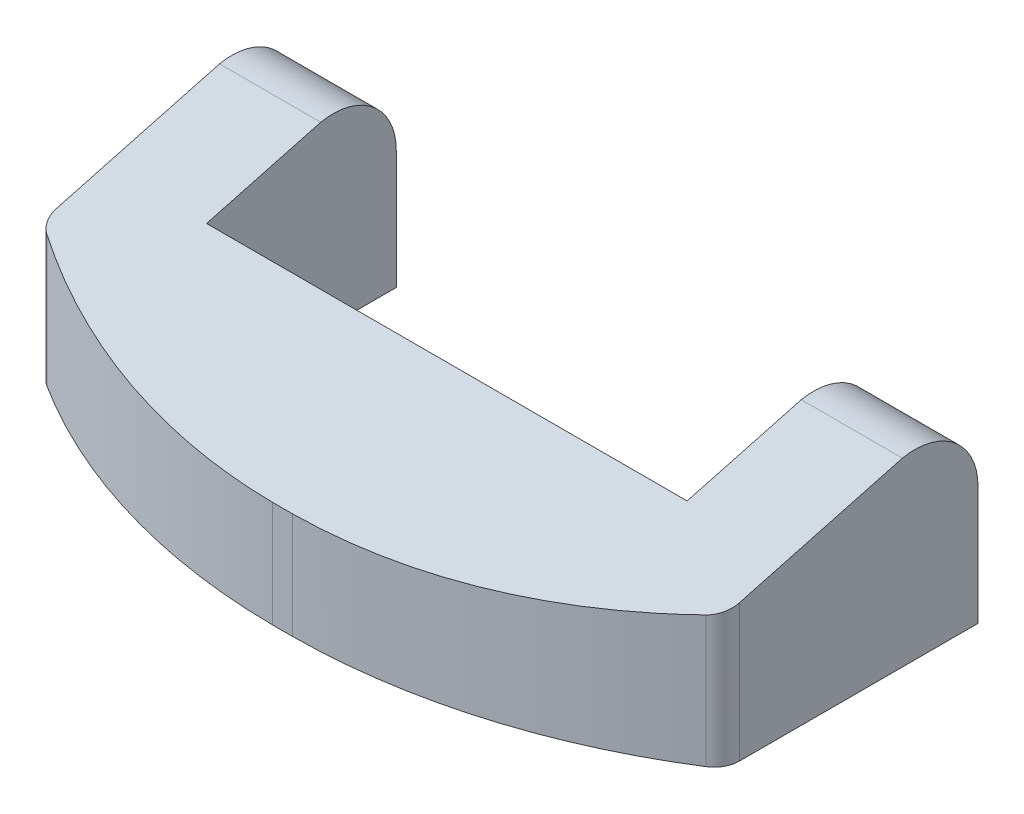
ISO-10303-21;
HEADER;
FILE_DESCRIPTION(('STEP AP214'),'2;1');
FILE_NAME('part.step','',(''),(''),'','','');
FILE_SCHEMA(('AUTOMOTIVE_DESIGN { 1 0 10303 214 1 1 1 1 }'));
ENDSEC;
DATA;
#1=APPLICATION_CONTEXT('core data for automotive mechanical design processes');
#2=APPLICATION_PROTOCOL_DEFINITION('international standard','automotive_design',2000,#1);
#3=PRODUCT_CONTEXT('',#1,'mechanical');
#4=PRODUCT('Part','Part','',(#3));
#5=PRODUCT_RELATED_PRODUCT_CATEGORY('part','',(#4));
#6=PRODUCT_DEFINITION_FORMATION('','',#4);
#7=PRODUCT_DEFINITION_CONTEXT('part definition',#1,'design');
#8=PRODUCT_DEFINITION('design','',#6,#7);
#9=PRODUCT_DEFINITION_SHAPE('','',#8);
#10=(LENGTH_UNIT() NAMED_UNIT(*) SI_UNIT(.MILLI.,.METRE.));
#11=(NAMED_UNIT(*) PLANE_ANGLE_UNIT() SI_UNIT($,.RADIAN.));
#12=(NAMED_UNIT(*) SI_UNIT($,.STERADIAN.) SOLID_ANGLE_UNIT());
#13=UNCERTAINTY_MEASURE_WITH_UNIT(LENGTH_MEASURE(1.E-05),#10,'distance_accuracy_value','');
#14=(GEOMETRIC_REPRESENTATION_CONTEXT(3) GLOBAL_UNCERTAINTY_ASSIGNED_CONTEXT((#13)) GLOBAL_UNIT_ASSIGNED_CONTEXT((#10,
#11,#12)) REPRESENTATION_CONTEXT('',''));
#15=CARTESIAN_POINT('',(0.,0.,0.));
#16=DIRECTION('',(0.,0.,1.));
#17=DIRECTION('',(1.,0.,0.));
#18=AXIS2_PLACEMENT_3D('',#15,#16,#17);
#19=CARTESIAN_POINT('',(813.18049605784,40.,85.));
#20=DIRECTION('',(0.,0.965897786096296,0.258923669860972));
#21=DIRECTION('',(0.,-0.258923669860972,0.965897786096296));
#22=AXIS2_PLACEMENT_3D('',#19,#20,#21);
#23=PLANE('',#22);
#24=CARTESIAN_POINT('',(1.97688044059947,104.33348696392,-154.991858077985));
#25=DIRECTION('',(0.,0.965897786096296,0.258923669860972));
#26=DIRECTION('',(0.,0.258923669860972,-0.965897786096296));
#27=AXIS2_PLACEMENT_3D('',#24,#25,#26);
#28=ELLIPSE('',#27,248.473496320938,240.);
#29=CARTESIAN_POINT('',(3.95376088120073,40.,85.));
#30=VERTEX_POINT('',#29);
#31=CARTESIAN_POINT('',(130.348831285191,49.9746034961205,47.7903951799216));
#32=VERTEX_POINT('',#31);
#33=EDGE_CURVE('E239',#30,#32,#28,.T.);
#34=ORIENTED_EDGE('',*,*,#33,.T.);
#35=CARTESIAN_POINT('',(125.,52.2395569739456,39.3411346275088));
#36=DIRECTION('',(0.,0.965897786096296,0.258923669860972));
#37=DIRECTION('',(0.,0.258923669860972,-0.965897786096296));
#38=AXIS2_PLACEMENT_3D('',#35,#36,#37);
#39=ELLIPSE('',#38,10.3530623467058,10.);
#40=CARTESIAN_POINT('',(135.,52.2395569739456,39.3411346275088));
#41=VERTEX_POINT('',#40);
#42=EDGE_CURVE('E230',#32,#41,#39,.T.);
#43=ORIENTED_EDGE('',*,*,#42,.T.);
#44=DIRECTION('',(0.,-0.258923669860972,0.965897786096296));
#45=VECTOR('',#44,1.);
#46=CARTESIAN_POINT('',(135.,72.1973903219302,-35.1102550675628));
#47=LINE('',#46,#45);
#48=CARTESIAN_POINT('',(135.,69.5183262802999,-25.1161821888245));
#49=VERTEX_POINT('',#48);
#50=EDGE_CURVE('E161',#49,#41,#47,.T.);
#51=ORIENTED_EDGE('',*,*,#50,.F.);
#52=DIRECTION('',(-1.,0.,0.));
#53=VECTOR('',#52,1.);
#54=CARTESIAN_POINT('',(813.18049605784,69.5183262802999,-25.1161821888245));
#55=LINE('',#54,#53);
#56=CARTESIAN_POINT('',(95.,69.5183262802999,-25.1161821888245));
#57=VERTEX_POINT('',#56);
#58=EDGE_CURVE('E243',#49,#57,#55,.T.);
#59=ORIENTED_EDGE('',*,*,#58,.T.);
#60=DIRECTION('',(0.,-0.258923669860972,0.965897786096296));
#61=VECTOR('',#60,1.);
#62=CARTESIAN_POINT('',(95.,54.8336504170334,29.6640389994772));
#63=LINE('',#62,#61);
#64=CARTESIAN_POINT('',(95.,57.4242438312052,20.));
#65=VERTEX_POINT('',#64);
#66=EDGE_CURVE('E251',#57,#65,#63,.T.);
#67=ORIENTED_EDGE('',*,*,#66,.T.);
#68=DIRECTION('',(-1.,0.,0.));
#69=VECTOR('',#68,1.);
#70=CARTESIAN_POINT('',(95.,57.4242438312052,20.));
#71=LINE('',#70,#69);
#72=CARTESIAN_POINT('',(-95.,57.4242438312052,20.));
#73=VERTEX_POINT('',#72);
#74=EDGE_CURVE('E248',#65,#73,#71,.T.);
#75=ORIENTED_EDGE('',*,*,#74,.T.);
#76=DIRECTION('',(0.,0.258923669860972,-0.965897786096296));
#77=VECTOR('',#76,1.);
#78=CARTESIAN_POINT('',(-95.,54.8336504170334,29.6640389994772));
#79=LINE('',#78,#77);
#80=CARTESIAN_POINT('',(-95.,69.5183262802999,-25.1161821888245));
#81=VERTEX_POINT('',#80);
#82=EDGE_CURVE('E167',#73,#81,#79,.T.);
#83=ORIENTED_EDGE('',*,*,#82,.T.);
#84=CARTESIAN_POINT('',(-135.,69.5183262802999,-25.1161821888245));
#85=VERTEX_POINT('',#84);
#86=EDGE_CURVE('E159',#81,#85,#55,.T.);
#87=ORIENTED_EDGE('',*,*,#86,.T.);
#88=DIRECTION('',(0.,0.258923669860972,-0.965897786096296));
#89=VECTOR('',#88,1.);
#90=CARTESIAN_POINT('',(-135.,72.1973903219302,-35.1102550675628));
#91=LINE('',#90,#89);
#92=CARTESIAN_POINT('',(-135.,52.2395569739456,39.3411346275088));
#93=VERTEX_POINT('',#92);
#94=EDGE_CURVE('E149',#93,#85,#91,.T.);
#95=ORIENTED_EDGE('',*,*,#94,.F.);
#96=CARTESIAN_POINT('',(-125.,52.2395569739456,39.3411346275088));
#97=DIRECTION('',(0.,0.965897786096296,0.258923669860972));
#98=DIRECTION('',(0.,0.258923669860972,-0.965897786096296));
#99=AXIS2_PLACEMENT_3D('',#96,#97,#98);
#100=ELLIPSE('',#99,10.3530623467058,10.);
#101=CARTESIAN_POINT('',(-130.348831285191,49.9746034961206,47.7903951799216));
#102=VERTEX_POINT('',#101);
#103=EDGE_CURVE('E137',#93,#102,#100,.T.);
#104=ORIENTED_EDGE('',*,*,#103,.T.);
#105=CARTESIAN_POINT('',(-1.97688044059947,104.33348696392,-154.991858077985));
#106=DIRECTION('',(0.,0.965897786096296,0.258923669860972));
#107=DIRECTION('',(0.,0.258923669860972,-0.965897786096296));
#108=AXIS2_PLACEMENT_3D('',#105,#106,#107);
#109=ELLIPSE('',#108,248.473496320938,240.);
#110=CARTESIAN_POINT('',(-3.95376088120073,40.,85.));
#111=VERTEX_POINT('',#110);
#112=EDGE_CURVE('E236',#102,#111,#109,.T.);
#113=ORIENTED_EDGE('',*,*,#112,.T.);
#114=DIRECTION('',(1.,0.,0.));
#115=VECTOR('',#114,1.);
#116=CARTESIAN_POINT('',(0.,40.,85.));
#117=LINE('',#116,#115);
#118=EDGE_CURVE('E204',#111,#30,#117,.T.);
#119=ORIENTED_EDGE('',*,*,#118,.T.);
#120=EDGE_LOOP('',(#34,#43,#51,#59,#67,#75,#83,#87,#95,#104,#113,#119));
#121=FACE_BOUND('',#120,.T.);
#122=ADVANCED_FACE('F35',(#121),#23,.T.);
#123=CARTESIAN_POINT('',(-135.,-2.,-55.));
#124=DIRECTION('',(-1.,0.,0.));
#125=DIRECTION('',(0.,0.,1.));
#126=AXIS2_PLACEMENT_3D('',#123,#124,#125);
#127=PLANE('',#126);
#128=DIRECTION('',(0.,0.,1.));
#129=VECTOR('',#128,1.);
#130=CARTESIAN_POINT('',(-135.,-2.,-55.));
#131=LINE('',#130,#129);
#132=CARTESIAN_POINT('',(-135.,-2.,-55.));
#133=VERTEX_POINT('',#132);
#134=CARTESIAN_POINT('',(-135.,-2.,39.3411346275088));
#135=VERTEX_POINT('',#134);
#136=EDGE_CURVE('E153',#133,#135,#131,.T.);
#137=ORIENTED_EDGE('',*,*,#136,.T.);
#138=DIRECTION('',(0.,1.,0.));
#139=VECTOR('',#138,1.);
#140=CARTESIAN_POINT('',(-135.,-451.43049605784,39.3411346275088));
#141=LINE('',#140,#139);
#142=EDGE_CURVE('E50',#135,#93,#141,.T.);
#143=ORIENTED_EDGE('',*,*,#142,.T.);
#144=ORIENTED_EDGE('',*,*,#94,.T.);
#145=CARTESIAN_POINT('',(-135.,45.,-30.));
#146=DIRECTION('',(-1.,0.,0.));
#147=DIRECTION('',(0.,0.,1.));
#148=AXIS2_PLACEMENT_3D('',#145,#146,#147);
#149=CIRCLE('',#148,25.);
#150=CARTESIAN_POINT('',(-135.,45.,-55.));
#151=VERTEX_POINT('',#150);
#152=EDGE_CURVE('E164',#85,#151,#149,.T.);
#153=ORIENTED_EDGE('',*,*,#152,.T.);
#154=DIRECTION('',(0.,1.,0.));
#155=VECTOR('',#154,1.);
#156=CARTESIAN_POINT('',(-135.,-2.,-55.));
#157=LINE('',#156,#155);
#158=EDGE_CURVE('E201',#133,#151,#157,.T.);
#159=ORIENTED_EDGE('',*,*,#158,.F.);
#160=EDGE_LOOP('',(#137,#143,#144,#153,#159));
#161=FACE_BOUND('',#160,.T.);
#162=ADVANCED_FACE('F37',(#161),#127,.T.);
#163=CARTESIAN_POINT('',(0.,0.,85.));
#164=DIRECTION('',(0.,0.,-1.));
#165=DIRECTION('',(-1.,0.,0.));
#166=AXIS2_PLACEMENT_3D('',#163,#164,#165);
#167=PLANE('',#166);
#168=DIRECTION('',(0.,1.,0.));
#169=VECTOR('',#168,1.);
#170=CARTESIAN_POINT('',(-3.95376088120073,-451.43049605784,85.));
#171=LINE('',#170,#169);
#172=CARTESIAN_POINT('',(-3.95376088120073,-2.,85.));
#173=VERTEX_POINT('',#172);
#174=EDGE_CURVE('E144',#173,#111,#171,.T.);
#175=ORIENTED_EDGE('',*,*,#174,.F.);
#176=DIRECTION('',(1.,0.,0.));
#177=VECTOR('',#176,1.);
#178=CARTESIAN_POINT('',(-135.,-2.,85.));
#179=LINE('',#178,#177);
#180=CARTESIAN_POINT('',(3.95376088120073,-2.,85.));
#181=VERTEX_POINT('',#180);
#182=EDGE_CURVE('E58',#173,#181,#179,.T.);
#183=ORIENTED_EDGE('',*,*,#182,.T.);
#184=DIRECTION('',(0.,1.,0.));
#185=VECTOR('',#184,1.);
#186=CARTESIAN_POINT('',(3.95376088120073,-451.43049605784,85.));
#187=LINE('',#186,#185);
#188=EDGE_CURVE('E225',#30,#181,#187,.F.);
#189=ORIENTED_EDGE('',*,*,#188,.F.);
#190=ORIENTED_EDGE('',*,*,#118,.F.);
#191=EDGE_LOOP('',(#175,#183,#189,#190));
#192=FACE_BOUND('',#191,.T.);
#193=ADVANCED_FACE('F266',(#192),#167,.F.);
#194=CARTESIAN_POINT('',(0.,-2.,0.));
#195=DIRECTION('',(0.,-1.,0.));
#196=DIRECTION('',(0.,0.,-1.));
#197=AXIS2_PLACEMENT_3D('',#194,#195,#196);
#198=PLANE('',#197);
#199=DIRECTION('',(0.,0.,-1.));
#200=VECTOR('',#199,1.);
#201=CARTESIAN_POINT('',(135.,-2.,-55.));
#202=LINE('',#201,#200);
#203=CARTESIAN_POINT('',(135.,-2.,39.3411346275088));
#204=VERTEX_POINT('',#203);
#205=CARTESIAN_POINT('',(135.,-2.,-55.));
#206=VERTEX_POINT('',#205);
#207=EDGE_CURVE('E194',#204,#206,#202,.T.);
#208=ORIENTED_EDGE('',*,*,#207,.F.);
#209=CARTESIAN_POINT('',(125.,-2.,39.3411346275088));
#210=DIRECTION('',(0.,-1.,0.));
#211=DIRECTION('',(0.,0.,-1.));
#212=AXIS2_PLACEMENT_3D('',#209,#210,#211);
#213=CIRCLE('',#212,10.);
#214=CARTESIAN_POINT('',(130.348831285191,-2.,47.7903951799216));
#215=VERTEX_POINT('',#214);
#216=EDGE_CURVE('E11',#204,#215,#213,.T.);
#217=ORIENTED_EDGE('',*,*,#216,.T.);
#218=CARTESIAN_POINT('',(1.97688044059947,-2.,-154.991858077985));
#219=DIRECTION('',(0.,-1.,0.));
#220=DIRECTION('',(0.,0.,-1.));
#221=AXIS2_PLACEMENT_3D('',#218,#219,#220);
#222=CIRCLE('',#221,240.);
#223=EDGE_CURVE('E43',#215,#181,#222,.T.);
#224=ORIENTED_EDGE('',*,*,#223,.T.);
#225=ORIENTED_EDGE('',*,*,#182,.F.);
#226=CARTESIAN_POINT('',(-1.97688044059947,-2.,-154.991858077985));
#227=DIRECTION('',(0.,-1.,0.));
#228=DIRECTION('',(0.,0.,-1.));
#229=AXIS2_PLACEMENT_3D('',#226,#227,#228);
#230=CIRCLE('',#229,240.);
#231=CARTESIAN_POINT('',(-130.348831285191,-2.,47.7903951799216));
#232=VERTEX_POINT('',#231);
#233=EDGE_CURVE('E213',#173,#232,#230,.T.);
#234=ORIENTED_EDGE('',*,*,#233,.T.);
#235=CARTESIAN_POINT('',(-125.,-2.,39.3411346275088));
#236=DIRECTION('',(0.,-1.,0.));
#237=DIRECTION('',(0.,0.,-1.));
#238=AXIS2_PLACEMENT_3D('',#235,#236,#237);
#239=CIRCLE('',#238,10.);
#240=EDGE_CURVE('E211',#232,#135,#239,.T.);
#241=ORIENTED_EDGE('',*,*,#240,.T.);
#242=ORIENTED_EDGE('',*,*,#136,.F.);
#243=DIRECTION('',(-1.,0.,0.));
#244=VECTOR('',#243,1.);
#245=CARTESIAN_POINT('',(135.,-2.,-55.));
#246=LINE('',#245,#244);
#247=CARTESIAN_POINT('',(-95.,-2.,-55.));
#248=VERTEX_POINT('',#247);
#249=EDGE_CURVE('E196',#248,#133,#246,.T.);
#250=ORIENTED_EDGE('',*,*,#249,.F.);
#251=DIRECTION('',(0.,0.,-1.));
#252=VECTOR('',#251,1.);
#253=CARTESIAN_POINT('',(-95.,-2.,0.));
#254=LINE('',#253,#252);
#255=CARTESIAN_POINT('',(-95.,-2.,20.));
#256=VERTEX_POINT('',#255);
#257=EDGE_CURVE('E191',#256,#248,#254,.T.);
#258=ORIENTED_EDGE('',*,*,#257,.F.);
#259=DIRECTION('',(-1.,0.,0.));
#260=VECTOR('',#259,1.);
#261=CARTESIAN_POINT('',(0.,-2.,20.));
#262=LINE('',#261,#260);
#263=CARTESIAN_POINT('',(95.,-2.,20.));
#264=VERTEX_POINT('',#263);
#265=EDGE_CURVE('E179',#264,#256,#262,.T.);
#266=ORIENTED_EDGE('',*,*,#265,.F.);
#267=DIRECTION('',(0.,0.,1.));
#268=VECTOR('',#267,1.);
#269=CARTESIAN_POINT('',(95.,-2.,0.));
#270=LINE('',#269,#268);
#271=CARTESIAN_POINT('',(95.,-2.,-55.));
#272=VERTEX_POINT('',#271);
#273=EDGE_CURVE('E189',#272,#264,#270,.T.);
#274=ORIENTED_EDGE('',*,*,#273,.F.);
#275=EDGE_CURVE('E197',#206,#272,#246,.T.);
#276=ORIENTED_EDGE('',*,*,#275,.F.);
#277=EDGE_LOOP('',(#208,#217,#224,#225,#234,#241,#242,#250,#258,#266,#274,#276));
#278=FACE_BOUND('',#277,.T.);
#279=ADVANCED_FACE('F218',(#278),#198,.T.);
#280=CARTESIAN_POINT('',(813.18049605784,45.,-30.));
#281=DIRECTION('',(-1.,0.,0.));
#282=DIRECTION('',(0.,0.,1.));
#283=AXIS2_PLACEMENT_3D('',#280,#281,#282);
#284=CYLINDRICAL_SURFACE('',#283,25.);
#285=CARTESIAN_POINT('',(135.,45.,-30.));
#286=DIRECTION('',(1.,0.,0.));
#287=DIRECTION('',(0.,0.,-1.));
#288=AXIS2_PLACEMENT_3D('',#285,#286,#287);
#289=CIRCLE('',#288,25.);
#290=CARTESIAN_POINT('',(135.,45.,-55.));
#291=VERTEX_POINT('',#290);
#292=EDGE_CURVE('E172',#291,#49,#289,.T.);
#293=ORIENTED_EDGE('',*,*,#292,.F.);
#294=DIRECTION('',(-1.,0.,0.));
#295=VECTOR('',#294,1.);
#296=CARTESIAN_POINT('',(813.18049605784,45.,-55.));
#297=LINE('',#296,#295);
#298=CARTESIAN_POINT('',(95.,45.,-55.));
#299=VERTEX_POINT('',#298);
#300=EDGE_CURVE('E247',#291,#299,#297,.T.);
#301=ORIENTED_EDGE('',*,*,#300,.T.);
#302=CARTESIAN_POINT('',(95.,45.,-30.));
#303=DIRECTION('',(1.,0.,0.));
#304=DIRECTION('',(0.,0.,-1.));
#305=AXIS2_PLACEMENT_3D('',#302,#303,#304);
#306=CIRCLE('',#305,25.);
#307=EDGE_CURVE('E208',#299,#57,#306,.T.);
#308=ORIENTED_EDGE('',*,*,#307,.T.);
#309=ORIENTED_EDGE('',*,*,#58,.F.);
#310=EDGE_LOOP('',(#293,#301,#308,#309));
#311=FACE_BOUND('',#310,.T.);
#312=ADVANCED_FACE('F273',(#311),#284,.T.);
#313=CARTESIAN_POINT('',(-95.,45.,-55.));
#314=VERTEX_POINT('',#313);
#315=EDGE_CURVE('E244',#314,#151,#297,.T.);
#316=ORIENTED_EDGE('',*,*,#315,.T.);
#317=ORIENTED_EDGE('',*,*,#152,.F.);
#318=ORIENTED_EDGE('',*,*,#86,.F.);
#319=CARTESIAN_POINT('',(-95.,45.,-30.));
#320=DIRECTION('',(-1.,0.,0.));
#321=DIRECTION('',(0.,0.,1.));
#322=AXIS2_PLACEMENT_3D('',#319,#320,#321);
#323=CIRCLE('',#322,25.);
#324=EDGE_CURVE('E160',#81,#314,#323,.T.);
#325=ORIENTED_EDGE('',*,*,#324,.T.);
#326=EDGE_LOOP('',(#316,#317,#318,#325));
#327=FACE_BOUND('',#326,.T.);
#328=ADVANCED_FACE('F256',(#327),#284,.T.);
#329=CARTESIAN_POINT('',(135.,-2.,-55.));
#330=DIRECTION('',(1.,0.,0.));
#331=DIRECTION('',(0.,0.,-1.));
#332=AXIS2_PLACEMENT_3D('',#329,#330,#331);
#333=PLANE('',#332);
#334=DIRECTION('',(0.,1.,0.));
#335=VECTOR('',#334,1.);
#336=CARTESIAN_POINT('',(135.,-451.43049605784,39.3411346275088));
#337=LINE('',#336,#335);
#338=EDGE_CURVE('E145',#204,#41,#337,.T.);
#339=ORIENTED_EDGE('',*,*,#338,.F.);
#340=ORIENTED_EDGE('',*,*,#207,.T.);
#341=DIRECTION('',(0.,1.,0.));
#342=VECTOR('',#341,1.);
#343=CARTESIAN_POINT('',(135.,-2.,-55.));
#344=LINE('',#343,#342);
#345=EDGE_CURVE('E200',#206,#291,#344,.T.);
#346=ORIENTED_EDGE('',*,*,#345,.T.);
#347=ORIENTED_EDGE('',*,*,#292,.T.);
#348=ORIENTED_EDGE('',*,*,#50,.T.);
#349=EDGE_LOOP('',(#339,#340,#346,#347,#348));
#350=FACE_BOUND('',#349,.T.);
#351=ADVANCED_FACE('F288',(#350),#333,.T.);
#352=CARTESIAN_POINT('',(-95.,-261.,-55.));
#353=DIRECTION('',(-1.,0.,0.));
#354=DIRECTION('',(0.,0.,1.));
#355=AXIS2_PLACEMENT_3D('',#352,#353,#354);
#356=PLANE('',#355);
#357=ORIENTED_EDGE('',*,*,#324,.F.);
#358=ORIENTED_EDGE('',*,*,#82,.F.);
#359=DIRECTION('',(0.,1.,0.));
#360=VECTOR('',#359,1.);
#361=CARTESIAN_POINT('',(-95.,-261.,20.));
#362=LINE('',#361,#360);
#363=EDGE_CURVE('E176',#256,#73,#362,.T.);
#364=ORIENTED_EDGE('',*,*,#363,.F.);
#365=ORIENTED_EDGE('',*,*,#257,.T.);
#366=DIRECTION('',(0.,1.,0.));
#367=VECTOR('',#366,1.);
#368=CARTESIAN_POINT('',(-95.,-261.,-55.));
#369=LINE('',#368,#367);
#370=EDGE_CURVE('E180',#248,#314,#369,.T.);
#371=ORIENTED_EDGE('',*,*,#370,.T.);
#372=EDGE_LOOP('',(#357,#358,#364,#365,#371));
#373=FACE_BOUND('',#372,.T.);
#374=ADVANCED_FACE('F314',(#373),#356,.F.);
#375=CARTESIAN_POINT('',(95.,-261.,-55.));
#376=DIRECTION('',(1.,0.,0.));
#377=DIRECTION('',(0.,0.,-1.));
#378=AXIS2_PLACEMENT_3D('',#375,#376,#377);
#379=PLANE('',#378);
#380=ORIENTED_EDGE('',*,*,#307,.F.);
#381=DIRECTION('',(0.,1.,0.));
#382=VECTOR('',#381,1.);
#383=CARTESIAN_POINT('',(95.,-261.,-55.));
#384=LINE('',#383,#382);
#385=EDGE_CURVE('E183',#272,#299,#384,.T.);
#386=ORIENTED_EDGE('',*,*,#385,.F.);
#387=ORIENTED_EDGE('',*,*,#273,.T.);
#388=DIRECTION('',(0.,1.,0.));
#389=VECTOR('',#388,1.);
#390=CARTESIAN_POINT('',(95.,-261.,20.));
#391=LINE('',#390,#389);
#392=EDGE_CURVE('E175',#264,#65,#391,.T.);
#393=ORIENTED_EDGE('',*,*,#392,.T.);
#394=ORIENTED_EDGE('',*,*,#66,.F.);
#395=EDGE_LOOP('',(#380,#386,#387,#393,#394));
#396=FACE_BOUND('',#395,.T.);
#397=ADVANCED_FACE('F297',(#396),#379,.F.);
#398=CARTESIAN_POINT('',(95.,-261.,20.));
#399=DIRECTION('',(0.,0.,1.));
#400=DIRECTION('',(1.,0.,0.));
#401=AXIS2_PLACEMENT_3D('',#398,#399,#400);
#402=PLANE('',#401);
#403=ORIENTED_EDGE('',*,*,#74,.F.);
#404=ORIENTED_EDGE('',*,*,#392,.F.);
#405=ORIENTED_EDGE('',*,*,#265,.T.);
#406=ORIENTED_EDGE('',*,*,#363,.T.);
#407=EDGE_LOOP('',(#403,#404,#405,#406));
#408=FACE_BOUND('',#407,.T.);
#409=ADVANCED_FACE('F301',(#408),#402,.F.);
#410=CARTESIAN_POINT('',(135.,-2.,-55.));
#411=DIRECTION('',(0.,0.,-1.));
#412=DIRECTION('',(-1.,0.,0.));
#413=AXIS2_PLACEMENT_3D('',#410,#411,#412);
#414=PLANE('',#413);
#415=ORIENTED_EDGE('',*,*,#315,.F.);
#416=ORIENTED_EDGE('',*,*,#370,.F.);
#417=ORIENTED_EDGE('',*,*,#249,.T.);
#418=ORIENTED_EDGE('',*,*,#158,.T.);
#419=EDGE_LOOP('',(#415,#416,#417,#418));
#420=FACE_BOUND('',#419,.T.);
#421=ADVANCED_FACE('F258',(#420),#414,.T.);
#422=ORIENTED_EDGE('',*,*,#300,.F.);
#423=ORIENTED_EDGE('',*,*,#345,.F.);
#424=ORIENTED_EDGE('',*,*,#275,.T.);
#425=ORIENTED_EDGE('',*,*,#385,.T.);
#426=EDGE_LOOP('',(#422,#423,#424,#425));
#427=FACE_BOUND('',#426,.T.);
#428=ADVANCED_FACE('F304',(#427),#414,.T.);
#429=CARTESIAN_POINT('',(-125.,-451.43049605784,39.3411346275088));
#430=DIRECTION('',(0.,1.,0.));
#431=DIRECTION('',(0.,0.,1.));
#432=AXIS2_PLACEMENT_3D('',#429,#430,#431);
#433=CYLINDRICAL_SURFACE('',#432,10.);
#434=ORIENTED_EDGE('',*,*,#103,.F.);
#435=ORIENTED_EDGE('',*,*,#142,.F.);
#436=ORIENTED_EDGE('',*,*,#240,.F.);
#437=DIRECTION('',(0.,1.,0.));
#438=VECTOR('',#437,1.);
#439=CARTESIAN_POINT('',(-130.348831285191,-451.43049605784,47.7903951799216));
#440=LINE('',#439,#438);
#441=EDGE_CURVE('E140',#232,#102,#440,.T.);
#442=ORIENTED_EDGE('',*,*,#441,.T.);
#443=EDGE_LOOP('',(#434,#435,#436,#442));
#444=FACE_BOUND('',#443,.T.);
#445=ADVANCED_FACE('F138',(#444),#433,.T.);
#446=CARTESIAN_POINT('',(-1.97688044059947,-451.43049605784,-154.991858077985));
#447=DIRECTION('',(0.,1.,0.));
#448=DIRECTION('',(0.,0.,1.));
#449=AXIS2_PLACEMENT_3D('',#446,#447,#448);
#450=CYLINDRICAL_SURFACE('',#449,240.);
#451=ORIENTED_EDGE('',*,*,#112,.F.);
#452=ORIENTED_EDGE('',*,*,#441,.F.);
#453=ORIENTED_EDGE('',*,*,#233,.F.);
#454=ORIENTED_EDGE('',*,*,#174,.T.);
#455=EDGE_LOOP('',(#451,#452,#453,#454));
#456=FACE_BOUND('',#455,.T.);
#457=ADVANCED_FACE('F264',(#456),#450,.T.);
#458=CARTESIAN_POINT('',(125.,-451.43049605784,39.3411346275088));
#459=DIRECTION('',(0.,1.,0.));
#460=DIRECTION('',(0.,0.,1.));
#461=AXIS2_PLACEMENT_3D('',#458,#459,#460);
#462=CYLINDRICAL_SURFACE('',#461,10.);
#463=ORIENTED_EDGE('',*,*,#42,.F.);
#464=DIRECTION('',(0.,1.,0.));
#465=VECTOR('',#464,1.);
#466=CARTESIAN_POINT('',(130.348831285191,-451.43049605784,47.7903951799216));
#467=LINE('',#466,#465);
#468=EDGE_CURVE('E224',#215,#32,#467,.T.);
#469=ORIENTED_EDGE('',*,*,#468,.F.);
#470=ORIENTED_EDGE('',*,*,#216,.F.);
#471=ORIENTED_EDGE('',*,*,#338,.T.);
#472=EDGE_LOOP('',(#463,#469,#470,#471));
#473=FACE_BOUND('',#472,.T.);
#474=ADVANCED_FACE('F227',(#473),#462,.T.);
#475=CARTESIAN_POINT('',(1.97688044059947,-451.43049605784,-154.991858077985));
#476=DIRECTION('',(0.,1.,0.));
#477=DIRECTION('',(0.,0.,1.));
#478=AXIS2_PLACEMENT_3D('',#475,#476,#477);
#479=CYLINDRICAL_SURFACE('',#478,240.);
#480=ORIENTED_EDGE('',*,*,#33,.F.);
#481=ORIENTED_EDGE('',*,*,#188,.T.);
#482=ORIENTED_EDGE('',*,*,#223,.F.);
#483=ORIENTED_EDGE('',*,*,#468,.T.);
#484=EDGE_LOOP('',(#480,#481,#482,#483));
#485=FACE_BOUND('',#484,.T.);
#486=ADVANCED_FACE('F223',(#485),#479,.T.);
#487=CLOSED_SHELL('',(#122,#162,#193,#279,#312,#328,#351,#374,#397,#409,#421,#428,#445,#457,
#474,#486));
#488=MANIFOLD_SOLID_BREP('B2',#487);
#489=ADVANCED_BREP_SHAPE_REPRESENTATION('',(#18,#488),#14);
#490=SHAPE_DEFINITION_REPRESENTATION(#9,#489);
ENDSEC;
END-ISO-10303-21;
